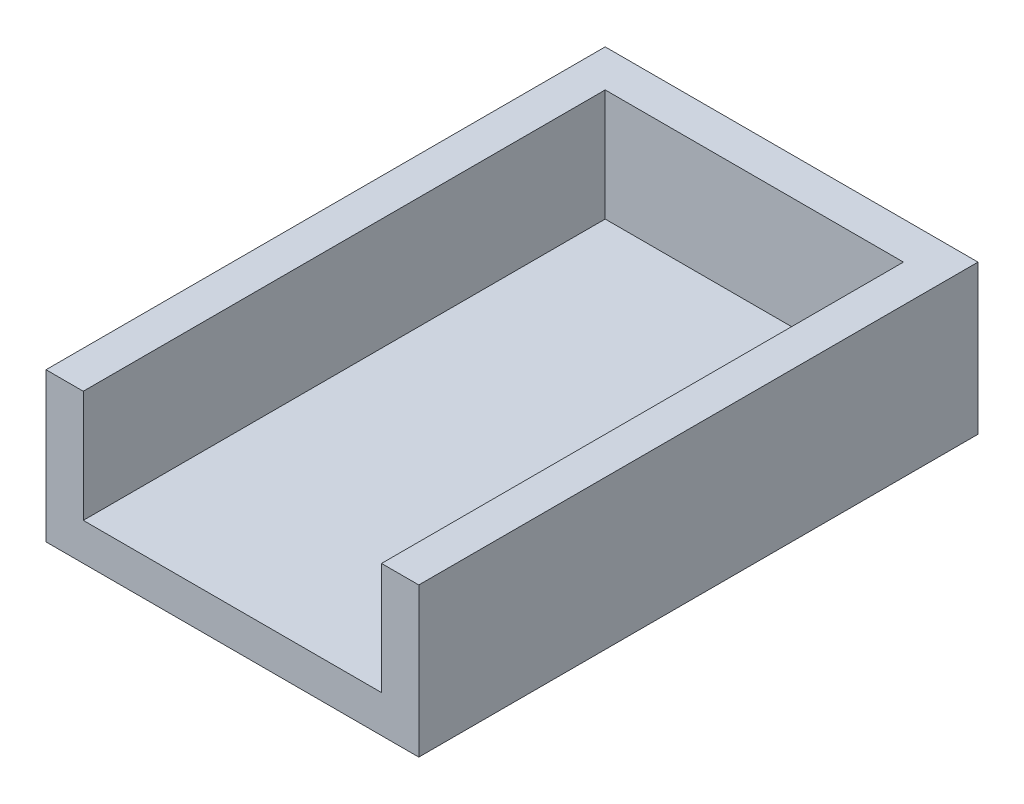
ISO-10303-21;
HEADER;
FILE_DESCRIPTION(('STEP AP214'),'2;1');
FILE_NAME('part.step','',(''),(''),'','','');
FILE_SCHEMA(('AUTOMOTIVE_DESIGN { 1 0 10303 214 1 1 1 1 }'));
ENDSEC;
DATA;
#1=APPLICATION_CONTEXT('core data for automotive mechanical design processes');
#2=APPLICATION_PROTOCOL_DEFINITION('international standard','automotive_design',2000,#1);
#3=PRODUCT_CONTEXT('',#1,'mechanical');
#4=PRODUCT('Part','Part','',(#3));
#5=PRODUCT_RELATED_PRODUCT_CATEGORY('part','',(#4));
#6=PRODUCT_DEFINITION_FORMATION('','',#4);
#7=PRODUCT_DEFINITION_CONTEXT('part definition',#1,'design');
#8=PRODUCT_DEFINITION('design','',#6,#7);
#9=PRODUCT_DEFINITION_SHAPE('','',#8);
#10=(LENGTH_UNIT() NAMED_UNIT(*) SI_UNIT(.MILLI.,.METRE.));
#11=(NAMED_UNIT(*) PLANE_ANGLE_UNIT() SI_UNIT($,.RADIAN.));
#12=(NAMED_UNIT(*) SI_UNIT($,.STERADIAN.) SOLID_ANGLE_UNIT());
#13=UNCERTAINTY_MEASURE_WITH_UNIT(LENGTH_MEASURE(1.E-05),#10,'distance_accuracy_value','');
#14=(GEOMETRIC_REPRESENTATION_CONTEXT(3) GLOBAL_UNCERTAINTY_ASSIGNED_CONTEXT((#13)) GLOBAL_UNIT_ASSIGNED_CONTEXT((#10,
#11,#12)) REPRESENTATION_CONTEXT('',''));
#15=CARTESIAN_POINT('',(0.,0.,0.));
#16=DIRECTION('',(0.,0.,1.));
#17=DIRECTION('',(1.,0.,0.));
#18=AXIS2_PLACEMENT_3D('',#15,#16,#17);
#19=CARTESIAN_POINT('',(-50.,40.,75.));
#20=DIRECTION('',(0.,0.,-1.));
#21=DIRECTION('',(-1.,0.,0.));
#22=AXIS2_PLACEMENT_3D('',#19,#20,#21);
#23=PLANE('',#22);
#24=DIRECTION('',(0.,1.,0.));
#25=VECTOR('',#24,1.);
#26=CARTESIAN_POINT('',(-40.,0.,75.));
#27=LINE('',#26,#25);
#28=CARTESIAN_POINT('',(-40.,10.,75.));
#29=VERTEX_POINT('',#28);
#30=CARTESIAN_POINT('',(-40.,40.,75.));
#31=VERTEX_POINT('',#30);
#32=EDGE_CURVE('E139',#29,#31,#27,.T.);
#33=ORIENTED_EDGE('',*,*,#32,.T.);
#34=DIRECTION('',(1.,0.,0.));
#35=VECTOR('',#34,1.);
#36=CARTESIAN_POINT('',(-50.,40.,75.));
#37=LINE('',#36,#35);
#38=CARTESIAN_POINT('',(-50.,40.,75.));
#39=VERTEX_POINT('',#38);
#40=EDGE_CURVE('E170',#39,#31,#37,.T.);
#41=ORIENTED_EDGE('',*,*,#40,.F.);
#42=DIRECTION('',(0.,-1.,0.));
#43=VECTOR('',#42,1.);
#44=CARTESIAN_POINT('',(-50.,40.,75.));
#45=LINE('',#44,#43);
#46=CARTESIAN_POINT('',(-50.,0.,75.));
#47=VERTEX_POINT('',#46);
#48=EDGE_CURVE('E188',#39,#47,#45,.T.);
#49=ORIENTED_EDGE('',*,*,#48,.T.);
#50=DIRECTION('',(1.,0.,0.));
#51=VECTOR('',#50,1.);
#52=CARTESIAN_POINT('',(-50.,0.,75.));
#53=LINE('',#52,#51);
#54=CARTESIAN_POINT('',(50.,0.,75.));
#55=VERTEX_POINT('',#54);
#56=EDGE_CURVE('E89',#47,#55,#53,.T.);
#57=ORIENTED_EDGE('',*,*,#56,.T.);
#58=DIRECTION('',(0.,-1.,0.));
#59=VECTOR('',#58,1.);
#60=CARTESIAN_POINT('',(50.,40.,75.));
#61=LINE('',#60,#59);
#62=CARTESIAN_POINT('',(50.,40.,75.));
#63=VERTEX_POINT('',#62);
#64=EDGE_CURVE('E174',#63,#55,#61,.T.);
#65=ORIENTED_EDGE('',*,*,#64,.F.);
#66=CARTESIAN_POINT('',(40.,40.,75.));
#67=VERTEX_POINT('',#66);
#68=EDGE_CURVE('E67',#67,#63,#37,.T.);
#69=ORIENTED_EDGE('',*,*,#68,.F.);
#70=DIRECTION('',(0.,1.,0.));
#71=VECTOR('',#70,1.);
#72=CARTESIAN_POINT('',(40.,0.,75.));
#73=LINE('',#72,#71);
#74=CARTESIAN_POINT('',(40.,10.,75.));
#75=VERTEX_POINT('',#74);
#76=EDGE_CURVE('E120',#75,#67,#73,.T.);
#77=ORIENTED_EDGE('',*,*,#76,.F.);
#78=DIRECTION('',(1.,0.,0.));
#79=VECTOR('',#78,1.);
#80=CARTESIAN_POINT('',(0.,10.,75.));
#81=LINE('',#80,#79);
#82=EDGE_CURVE('E130',#29,#75,#81,.T.);
#83=ORIENTED_EDGE('',*,*,#82,.F.);
#84=EDGE_LOOP('',(#33,#41,#49,#57,#65,#69,#77,#83));
#85=FACE_BOUND('',#84,.T.);
#86=ADVANCED_FACE('F43',(#85),#23,.F.);
#87=CARTESIAN_POINT('',(0.,40.,0.));
#88=DIRECTION('',(0.,-1.,0.));
#89=DIRECTION('',(0.,0.,-1.));
#90=AXIS2_PLACEMENT_3D('',#87,#88,#89);
#91=PLANE('',#90);
#92=ORIENTED_EDGE('',*,*,#40,.T.);
#93=DIRECTION('',(0.,0.,1.));
#94=VECTOR('',#93,1.);
#95=CARTESIAN_POINT('',(-40.,40.,65.));
#96=LINE('',#95,#94);
#97=CARTESIAN_POINT('',(-40.,40.,-65.));
#98=VERTEX_POINT('',#97);
#99=EDGE_CURVE('E127',#98,#31,#96,.T.);
#100=ORIENTED_EDGE('',*,*,#99,.F.);
#101=DIRECTION('',(-1.,0.,0.));
#102=VECTOR('',#101,1.);
#103=CARTESIAN_POINT('',(-40.,40.,-65.));
#104=LINE('',#103,#102);
#105=CARTESIAN_POINT('',(40.,40.,-65.));
#106=VERTEX_POINT('',#105);
#107=EDGE_CURVE('E150',#106,#98,#104,.T.);
#108=ORIENTED_EDGE('',*,*,#107,.F.);
#109=DIRECTION('',(0.,0.,-1.));
#110=VECTOR('',#109,1.);
#111=CARTESIAN_POINT('',(40.,40.,65.));
#112=LINE('',#111,#110);
#113=EDGE_CURVE('E59',#67,#106,#112,.T.);
#114=ORIENTED_EDGE('',*,*,#113,.F.);
#115=ORIENTED_EDGE('',*,*,#68,.T.);
#116=DIRECTION('',(0.,0.,-1.));
#117=VECTOR('',#116,1.);
#118=CARTESIAN_POINT('',(50.,40.,75.));
#119=LINE('',#118,#117);
#120=CARTESIAN_POINT('',(50.,40.,-75.));
#121=VERTEX_POINT('',#120);
#122=EDGE_CURVE('E162',#63,#121,#119,.T.);
#123=ORIENTED_EDGE('',*,*,#122,.T.);
#124=DIRECTION('',(-1.,0.,0.));
#125=VECTOR('',#124,1.);
#126=CARTESIAN_POINT('',(-50.,40.,-75.));
#127=LINE('',#126,#125);
#128=CARTESIAN_POINT('',(-50.,40.,-75.));
#129=VERTEX_POINT('',#128);
#130=EDGE_CURVE('E96',#121,#129,#127,.T.);
#131=ORIENTED_EDGE('',*,*,#130,.T.);
#132=DIRECTION('',(0.,0.,1.));
#133=VECTOR('',#132,1.);
#134=CARTESIAN_POINT('',(-50.,40.,75.));
#135=LINE('',#134,#133);
#136=EDGE_CURVE('E167',#129,#39,#135,.T.);
#137=ORIENTED_EDGE('',*,*,#136,.T.);
#138=EDGE_LOOP('',(#92,#100,#108,#114,#115,#123,#131,#137));
#139=FACE_BOUND('',#138,.T.);
#140=ADVANCED_FACE('F203',(#139),#91,.F.);
#141=CARTESIAN_POINT('',(50.,40.,75.));
#142=DIRECTION('',(-1.,0.,0.));
#143=DIRECTION('',(0.,0.,1.));
#144=AXIS2_PLACEMENT_3D('',#141,#142,#143);
#145=PLANE('',#144);
#146=DIRECTION('',(0.,0.,-1.));
#147=VECTOR('',#146,1.);
#148=CARTESIAN_POINT('',(50.,0.,75.));
#149=LINE('',#148,#147);
#150=CARTESIAN_POINT('',(50.,0.,-75.));
#151=VERTEX_POINT('',#150);
#152=EDGE_CURVE('E159',#55,#151,#149,.T.);
#153=ORIENTED_EDGE('',*,*,#152,.T.);
#154=DIRECTION('',(0.,-1.,0.));
#155=VECTOR('',#154,1.);
#156=CARTESIAN_POINT('',(50.,40.,-75.));
#157=LINE('',#156,#155);
#158=EDGE_CURVE('E11',#121,#151,#157,.T.);
#159=ORIENTED_EDGE('',*,*,#158,.F.);
#160=ORIENTED_EDGE('',*,*,#122,.F.);
#161=ORIENTED_EDGE('',*,*,#64,.T.);
#162=EDGE_LOOP('',(#153,#159,#160,#161));
#163=FACE_BOUND('',#162,.T.);
#164=ADVANCED_FACE('F45',(#163),#145,.F.);
#165=CARTESIAN_POINT('',(-50.,40.,-75.));
#166=DIRECTION('',(0.,0.,1.));
#167=DIRECTION('',(1.,0.,0.));
#168=AXIS2_PLACEMENT_3D('',#165,#166,#167);
#169=PLANE('',#168);
#170=DIRECTION('',(-1.,0.,0.));
#171=VECTOR('',#170,1.);
#172=CARTESIAN_POINT('',(-50.,0.,-75.));
#173=LINE('',#172,#171);
#174=CARTESIAN_POINT('',(-50.,0.,-75.));
#175=VERTEX_POINT('',#174);
#176=EDGE_CURVE('E178',#151,#175,#173,.T.);
#177=ORIENTED_EDGE('',*,*,#176,.T.);
#178=DIRECTION('',(0.,-1.,0.));
#179=VECTOR('',#178,1.);
#180=CARTESIAN_POINT('',(-50.,40.,-75.));
#181=LINE('',#180,#179);
#182=EDGE_CURVE('E52',#129,#175,#181,.T.);
#183=ORIENTED_EDGE('',*,*,#182,.F.);
#184=ORIENTED_EDGE('',*,*,#130,.F.);
#185=ORIENTED_EDGE('',*,*,#158,.T.);
#186=EDGE_LOOP('',(#177,#183,#184,#185));
#187=FACE_BOUND('',#186,.T.);
#188=ADVANCED_FACE('F229',(#187),#169,.F.);
#189=CARTESIAN_POINT('',(-50.,40.,75.));
#190=DIRECTION('',(1.,0.,0.));
#191=DIRECTION('',(0.,0.,-1.));
#192=AXIS2_PLACEMENT_3D('',#189,#190,#191);
#193=PLANE('',#192);
#194=DIRECTION('',(0.,0.,1.));
#195=VECTOR('',#194,1.);
#196=CARTESIAN_POINT('',(-50.,0.,75.));
#197=LINE('',#196,#195);
#198=EDGE_CURVE('E181',#175,#47,#197,.T.);
#199=ORIENTED_EDGE('',*,*,#198,.T.);
#200=ORIENTED_EDGE('',*,*,#48,.F.);
#201=ORIENTED_EDGE('',*,*,#136,.F.);
#202=ORIENTED_EDGE('',*,*,#182,.T.);
#203=EDGE_LOOP('',(#199,#200,#201,#202));
#204=FACE_BOUND('',#203,.T.);
#205=ADVANCED_FACE('F195',(#204),#193,.F.);
#206=CARTESIAN_POINT('',(0.,0.,0.));
#207=DIRECTION('',(0.,-1.,0.));
#208=DIRECTION('',(0.,0.,-1.));
#209=AXIS2_PLACEMENT_3D('',#206,#207,#208);
#210=PLANE('',#209);
#211=ORIENTED_EDGE('',*,*,#152,.F.);
#212=ORIENTED_EDGE('',*,*,#56,.F.);
#213=ORIENTED_EDGE('',*,*,#198,.F.);
#214=ORIENTED_EDGE('',*,*,#176,.F.);
#215=EDGE_LOOP('',(#211,#212,#213,#214));
#216=FACE_BOUND('',#215,.T.);
#217=ADVANCED_FACE('F199',(#216),#210,.T.);
#218=CARTESIAN_POINT('',(40.,10.,65.));
#219=DIRECTION('',(1.,0.,0.));
#220=DIRECTION('',(0.,0.,-1.));
#221=AXIS2_PLACEMENT_3D('',#218,#219,#220);
#222=PLANE('',#221);
#223=ORIENTED_EDGE('',*,*,#113,.T.);
#224=DIRECTION('',(0.,1.,0.));
#225=VECTOR('',#224,1.);
#226=CARTESIAN_POINT('',(40.,10.,-65.));
#227=LINE('',#226,#225);
#228=CARTESIAN_POINT('',(40.,10.,-65.));
#229=VERTEX_POINT('',#228);
#230=EDGE_CURVE('E121',#229,#106,#227,.T.);
#231=ORIENTED_EDGE('',*,*,#230,.F.);
#232=DIRECTION('',(0.,0.,-1.));
#233=VECTOR('',#232,1.);
#234=CARTESIAN_POINT('',(40.,10.,65.));
#235=LINE('',#234,#233);
#236=EDGE_CURVE('E116',#75,#229,#235,.T.);
#237=ORIENTED_EDGE('',*,*,#236,.F.);
#238=ORIENTED_EDGE('',*,*,#76,.T.);
#239=EDGE_LOOP('',(#223,#231,#237,#238));
#240=FACE_BOUND('',#239,.T.);
#241=ADVANCED_FACE('F118',(#240),#222,.F.);
#242=CARTESIAN_POINT('',(-40.,10.,65.));
#243=DIRECTION('',(-1.,0.,0.));
#244=DIRECTION('',(0.,0.,1.));
#245=AXIS2_PLACEMENT_3D('',#242,#243,#244);
#246=PLANE('',#245);
#247=ORIENTED_EDGE('',*,*,#32,.F.);
#248=DIRECTION('',(0.,0.,1.));
#249=VECTOR('',#248,1.);
#250=CARTESIAN_POINT('',(-40.,10.,65.));
#251=LINE('',#250,#249);
#252=CARTESIAN_POINT('',(-40.,10.,-65.));
#253=VERTEX_POINT('',#252);
#254=EDGE_CURVE('E133',#253,#29,#251,.T.);
#255=ORIENTED_EDGE('',*,*,#254,.F.);
#256=DIRECTION('',(0.,1.,0.));
#257=VECTOR('',#256,1.);
#258=CARTESIAN_POINT('',(-40.,10.,-65.));
#259=LINE('',#258,#257);
#260=EDGE_CURVE('E156',#253,#98,#259,.T.);
#261=ORIENTED_EDGE('',*,*,#260,.T.);
#262=ORIENTED_EDGE('',*,*,#99,.T.);
#263=EDGE_LOOP('',(#247,#255,#261,#262));
#264=FACE_BOUND('',#263,.T.);
#265=ADVANCED_FACE('F207',(#264),#246,.F.);
#266=CARTESIAN_POINT('',(-40.,10.,-65.));
#267=DIRECTION('',(0.,0.,-1.));
#268=DIRECTION('',(-1.,0.,0.));
#269=AXIS2_PLACEMENT_3D('',#266,#267,#268);
#270=PLANE('',#269);
#271=ORIENTED_EDGE('',*,*,#107,.T.);
#272=ORIENTED_EDGE('',*,*,#260,.F.);
#273=DIRECTION('',(-1.,0.,0.));
#274=VECTOR('',#273,1.);
#275=CARTESIAN_POINT('',(-40.,10.,-65.));
#276=LINE('',#275,#274);
#277=EDGE_CURVE('E126',#229,#253,#276,.T.);
#278=ORIENTED_EDGE('',*,*,#277,.F.);
#279=ORIENTED_EDGE('',*,*,#230,.T.);
#280=EDGE_LOOP('',(#271,#272,#278,#279));
#281=FACE_BOUND('',#280,.T.);
#282=ADVANCED_FACE('F210',(#281),#270,.F.);
#283=CARTESIAN_POINT('',(0.,10.,0.));
#284=DIRECTION('',(0.,-1.,0.));
#285=DIRECTION('',(0.,0.,-1.));
#286=AXIS2_PLACEMENT_3D('',#283,#284,#285);
#287=PLANE('',#286);
#288=ORIENTED_EDGE('',*,*,#236,.T.);
#289=ORIENTED_EDGE('',*,*,#277,.T.);
#290=ORIENTED_EDGE('',*,*,#254,.T.);
#291=ORIENTED_EDGE('',*,*,#82,.T.);
#292=EDGE_LOOP('',(#288,#289,#290,#291));
#293=FACE_BOUND('',#292,.T.);
#294=ADVANCED_FACE('F131',(#293),#287,.F.);
#295=CLOSED_SHELL('',(#86,#140,#164,#188,#205,#217,#241,#265,#282,#294));
#296=MANIFOLD_SOLID_BREP('B2',#295);
#297=ADVANCED_BREP_SHAPE_REPRESENTATION('',(#18,#296),#14);
#298=SHAPE_DEFINITION_REPRESENTATION(#9,#297);
ENDSEC;
END-ISO-10303-21;
